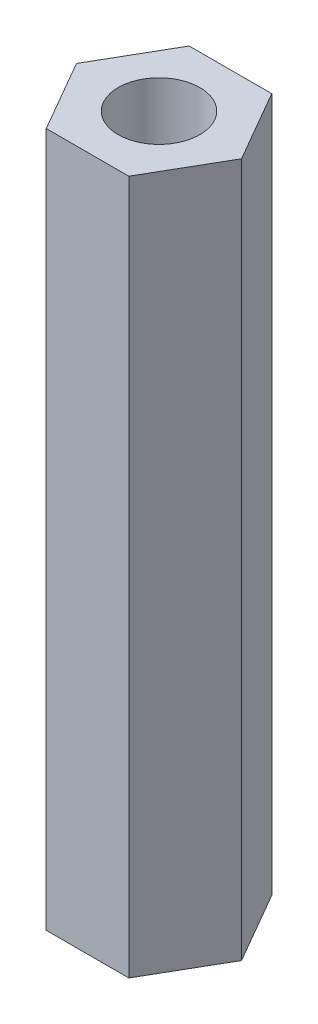
ISO-10303-21;
HEADER;
FILE_DESCRIPTION(('STEP AP214'),'2;1');
FILE_NAME('part.step','',(''),(''),'','','');
FILE_SCHEMA(('AUTOMOTIVE_DESIGN { 1 0 10303 214 1 1 1 1 }'));
ENDSEC;
DATA;
#1=APPLICATION_CONTEXT('core data for automotive mechanical design processes');
#2=APPLICATION_PROTOCOL_DEFINITION('international standard','automotive_design',2000,#1);
#3=PRODUCT_CONTEXT('',#1,'mechanical');
#4=PRODUCT('Part','Part','',(#3));
#5=PRODUCT_RELATED_PRODUCT_CATEGORY('part','',(#4));
#6=PRODUCT_DEFINITION_FORMATION('','',#4);
#7=PRODUCT_DEFINITION_CONTEXT('part definition',#1,'design');
#8=PRODUCT_DEFINITION('design','',#6,#7);
#9=PRODUCT_DEFINITION_SHAPE('','',#8);
#10=(LENGTH_UNIT() NAMED_UNIT(*) SI_UNIT(.MILLI.,.METRE.));
#11=(NAMED_UNIT(*) PLANE_ANGLE_UNIT() SI_UNIT($,.RADIAN.));
#12=(NAMED_UNIT(*) SI_UNIT($,.STERADIAN.) SOLID_ANGLE_UNIT());
#13=UNCERTAINTY_MEASURE_WITH_UNIT(LENGTH_MEASURE(1.E-05),#10,'distance_accuracy_value','');
#14=(GEOMETRIC_REPRESENTATION_CONTEXT(3) GLOBAL_UNCERTAINTY_ASSIGNED_CONTEXT((#13)) GLOBAL_UNIT_ASSIGNED_CONTEXT((#10,
#11,#12)) REPRESENTATION_CONTEXT('',''));
#15=CARTESIAN_POINT('',(0.,0.,0.));
#16=DIRECTION('',(0.,0.,1.));
#17=DIRECTION('',(1.,0.,0.));
#18=AXIS2_PLACEMENT_3D('',#15,#16,#17);
#19=CARTESIAN_POINT('',(0.,34.,0.));
#20=DIRECTION('',(0.,1.,0.));
#21=DIRECTION('',(0.,0.,1.));
#22=AXIS2_PLACEMENT_3D('',#19,#20,#21);
#23=PLANE('',#22);
#24=DIRECTION('',(-0.5,0.,-0.866025403784438));
#25=VECTOR('',#24,1.);
#26=CARTESIAN_POINT('',(4.04145188432738,34.,0.));
#27=LINE('',#26,#25);
#28=CARTESIAN_POINT('',(4.04145188432738,34.,0.));
#29=VERTEX_POINT('',#28);
#30=CARTESIAN_POINT('',(2.02072594216369,34.,-3.5));
#31=VERTEX_POINT('',#30);
#32=EDGE_CURVE('E152',#29,#31,#27,.T.);
#33=ORIENTED_EDGE('',*,*,#32,.T.);
#34=DIRECTION('',(-1.,0.,0.));
#35=VECTOR('',#34,1.);
#36=CARTESIAN_POINT('',(2.02072594216369,34.,-3.5));
#37=LINE('',#36,#35);
#38=CARTESIAN_POINT('',(-2.02072594216369,34.,-3.5));
#39=VERTEX_POINT('',#38);
#40=EDGE_CURVE('E100',#31,#39,#37,.T.);
#41=ORIENTED_EDGE('',*,*,#40,.T.);
#42=DIRECTION('',(-0.5,0.,0.866025403784439));
#43=VECTOR('',#42,1.);
#44=CARTESIAN_POINT('',(-2.02072594216369,34.,-3.5));
#45=LINE('',#44,#43);
#46=CARTESIAN_POINT('',(-4.04145188432738,34.,0.));
#47=VERTEX_POINT('',#46);
#48=EDGE_CURVE('E113',#39,#47,#45,.T.);
#49=ORIENTED_EDGE('',*,*,#48,.T.);
#50=DIRECTION('',(0.5,0.,0.866025403784438));
#51=VECTOR('',#50,1.);
#52=CARTESIAN_POINT('',(-4.04145188432738,34.,0.));
#53=LINE('',#52,#51);
#54=CARTESIAN_POINT('',(-2.02072594216369,34.,3.5));
#55=VERTEX_POINT('',#54);
#56=EDGE_CURVE('E107',#47,#55,#53,.T.);
#57=ORIENTED_EDGE('',*,*,#56,.T.);
#58=DIRECTION('',(1.,0.,0.));
#59=VECTOR('',#58,1.);
#60=CARTESIAN_POINT('',(-2.02072594216369,34.,3.5));
#61=LINE('',#60,#59);
#62=CARTESIAN_POINT('',(2.02072594216369,34.,3.5));
#63=VERTEX_POINT('',#62);
#64=EDGE_CURVE('E111',#55,#63,#61,.T.);
#65=ORIENTED_EDGE('',*,*,#64,.T.);
#66=DIRECTION('',(0.5,0.,-0.866025403784439));
#67=VECTOR('',#66,1.);
#68=CARTESIAN_POINT('',(2.02072594216369,34.,3.5));
#69=LINE('',#68,#67);
#70=EDGE_CURVE('E63',#63,#29,#69,.T.);
#71=ORIENTED_EDGE('',*,*,#70,.T.);
#72=EDGE_LOOP('',(#33,#41,#49,#57,#65,#71));
#73=FACE_BOUND('',#72,.T.);
#74=CARTESIAN_POINT('',(0.,34.,0.));
#75=DIRECTION('',(0.,1.,0.));
#76=DIRECTION('',(0.,0.,1.));
#77=AXIS2_PLACEMENT_3D('',#74,#75,#76);
#78=CIRCLE('',#77,2.);
#79=CARTESIAN_POINT('',(0.,34.,2.));
#80=VERTEX_POINT('',#79);
#81=EDGE_CURVE('E140',#80,#80,#78,.T.);
#82=ORIENTED_EDGE('',*,*,#81,.F.);
#83=EDGE_LOOP('',(#82));
#84=FACE_BOUND('',#83,.T.);
#85=ADVANCED_FACE('F45',(#73,#84),#23,.T.);
#86=CARTESIAN_POINT('',(0.,0.,0.));
#87=DIRECTION('',(0.,1.,0.));
#88=DIRECTION('',(0.,0.,1.));
#89=AXIS2_PLACEMENT_3D('',#86,#87,#88);
#90=PLANE('',#89);
#91=DIRECTION('',(-0.5,0.,-0.866025403784438));
#92=VECTOR('',#91,1.);
#93=CARTESIAN_POINT('',(4.04145188432738,0.,0.));
#94=LINE('',#93,#92);
#95=CARTESIAN_POINT('',(4.04145188432738,0.,0.));
#96=VERTEX_POINT('',#95);
#97=CARTESIAN_POINT('',(2.02072594216369,0.,-3.5));
#98=VERTEX_POINT('',#97);
#99=EDGE_CURVE('E135',#96,#98,#94,.T.);
#100=ORIENTED_EDGE('',*,*,#99,.F.);
#101=DIRECTION('',(0.5,0.,-0.866025403784439));
#102=VECTOR('',#101,1.);
#103=CARTESIAN_POINT('',(2.02072594216369,0.,3.5));
#104=LINE('',#103,#102);
#105=CARTESIAN_POINT('',(2.02072594216369,0.,3.5));
#106=VERTEX_POINT('',#105);
#107=EDGE_CURVE('E92',#106,#96,#104,.T.);
#108=ORIENTED_EDGE('',*,*,#107,.F.);
#109=DIRECTION('',(1.,0.,0.));
#110=VECTOR('',#109,1.);
#111=CARTESIAN_POINT('',(-2.02072594216369,0.,3.5));
#112=LINE('',#111,#110);
#113=CARTESIAN_POINT('',(-2.02072594216369,0.,3.5));
#114=VERTEX_POINT('',#113);
#115=EDGE_CURVE('E86',#114,#106,#112,.T.);
#116=ORIENTED_EDGE('',*,*,#115,.F.);
#117=DIRECTION('',(0.5,0.,0.866025403784438));
#118=VECTOR('',#117,1.);
#119=CARTESIAN_POINT('',(-4.04145188432738,0.,0.));
#120=LINE('',#119,#118);
#121=CARTESIAN_POINT('',(-4.04145188432738,0.,0.));
#122=VERTEX_POINT('',#121);
#123=EDGE_CURVE('E122',#122,#114,#120,.T.);
#124=ORIENTED_EDGE('',*,*,#123,.F.);
#125=DIRECTION('',(-0.5,0.,0.866025403784439));
#126=VECTOR('',#125,1.);
#127=CARTESIAN_POINT('',(-2.02072594216369,0.,-3.5));
#128=LINE('',#127,#126);
#129=CARTESIAN_POINT('',(-2.02072594216369,0.,-3.5));
#130=VERTEX_POINT('',#129);
#131=EDGE_CURVE('E143',#130,#122,#128,.T.);
#132=ORIENTED_EDGE('',*,*,#131,.F.);
#133=DIRECTION('',(-1.,0.,0.));
#134=VECTOR('',#133,1.);
#135=CARTESIAN_POINT('',(2.02072594216369,0.,-3.5));
#136=LINE('',#135,#134);
#137=EDGE_CURVE('E139',#98,#130,#136,.T.);
#138=ORIENTED_EDGE('',*,*,#137,.F.);
#139=EDGE_LOOP('',(#100,#108,#116,#124,#132,#138));
#140=FACE_BOUND('',#139,.T.);
#141=CARTESIAN_POINT('',(0.,0.,0.));
#142=DIRECTION('',(0.,1.,0.));
#143=DIRECTION('',(0.,0.,1.));
#144=AXIS2_PLACEMENT_3D('',#141,#142,#143);
#145=CIRCLE('',#144,2.);
#146=CARTESIAN_POINT('',(0.,0.,2.));
#147=VERTEX_POINT('',#146);
#148=EDGE_CURVE('E249',#147,#147,#145,.T.);
#149=ORIENTED_EDGE('',*,*,#148,.T.);
#150=EDGE_LOOP('',(#149));
#151=FACE_BOUND('',#150,.T.);
#152=ADVANCED_FACE('F165',(#140,#151),#90,.F.);
#153=CARTESIAN_POINT('',(4.04145188432738,34.,0.));
#154=DIRECTION('',(-0.866025403784439,0.,0.5));
#155=DIRECTION('',(0.5,0.,0.866025403784439));
#156=AXIS2_PLACEMENT_3D('',#153,#154,#155);
#157=PLANE('',#156);
#158=ORIENTED_EDGE('',*,*,#99,.T.);
#159=DIRECTION('',(0.,-1.,0.));
#160=VECTOR('',#159,1.);
#161=CARTESIAN_POINT('',(2.02072594216369,34.,-3.5));
#162=LINE('',#161,#160);
#163=EDGE_CURVE('E11',#31,#98,#162,.T.);
#164=ORIENTED_EDGE('',*,*,#163,.F.);
#165=ORIENTED_EDGE('',*,*,#32,.F.);
#166=DIRECTION('',(0.,-1.,0.));
#167=VECTOR('',#166,1.);
#168=CARTESIAN_POINT('',(4.04145188432738,34.,0.));
#169=LINE('',#168,#167);
#170=EDGE_CURVE('E131',#29,#96,#169,.T.);
#171=ORIENTED_EDGE('',*,*,#170,.T.);
#172=EDGE_LOOP('',(#158,#164,#165,#171));
#173=FACE_BOUND('',#172,.T.);
#174=ADVANCED_FACE('F47',(#173),#157,.F.);
#175=CARTESIAN_POINT('',(2.02072594216369,34.,-3.5));
#176=DIRECTION('',(0.,0.,1.));
#177=DIRECTION('',(1.,0.,0.));
#178=AXIS2_PLACEMENT_3D('',#175,#176,#177);
#179=PLANE('',#178);
#180=ORIENTED_EDGE('',*,*,#137,.T.);
#181=DIRECTION('',(0.,-1.,0.));
#182=VECTOR('',#181,1.);
#183=CARTESIAN_POINT('',(-2.02072594216369,34.,-3.5));
#184=LINE('',#183,#182);
#185=EDGE_CURVE('E55',#39,#130,#184,.T.);
#186=ORIENTED_EDGE('',*,*,#185,.F.);
#187=ORIENTED_EDGE('',*,*,#40,.F.);
#188=ORIENTED_EDGE('',*,*,#163,.T.);
#189=EDGE_LOOP('',(#180,#186,#187,#188));
#190=FACE_BOUND('',#189,.T.);
#191=ADVANCED_FACE('F190',(#190),#179,.F.);
#192=CARTESIAN_POINT('',(-2.02072594216369,34.,-3.5));
#193=DIRECTION('',(0.866025403784439,0.,0.5));
#194=DIRECTION('',(0.5,0.,-0.866025403784439));
#195=AXIS2_PLACEMENT_3D('',#192,#193,#194);
#196=PLANE('',#195);
#197=ORIENTED_EDGE('',*,*,#131,.T.);
#198=DIRECTION('',(0.,-1.,0.));
#199=VECTOR('',#198,1.);
#200=CARTESIAN_POINT('',(-4.04145188432738,34.,0.));
#201=LINE('',#200,#199);
#202=EDGE_CURVE('E124',#47,#122,#201,.T.);
#203=ORIENTED_EDGE('',*,*,#202,.F.);
#204=ORIENTED_EDGE('',*,*,#48,.F.);
#205=ORIENTED_EDGE('',*,*,#185,.T.);
#206=EDGE_LOOP('',(#197,#203,#204,#205));
#207=FACE_BOUND('',#206,.T.);
#208=ADVANCED_FACE('F162',(#207),#196,.F.);
#209=CARTESIAN_POINT('',(-4.04145188432738,34.,0.));
#210=DIRECTION('',(0.866025403784438,0.,-0.5));
#211=DIRECTION('',(-0.5,0.,-0.866025403784438));
#212=AXIS2_PLACEMENT_3D('',#209,#210,#211);
#213=PLANE('',#212);
#214=ORIENTED_EDGE('',*,*,#123,.T.);
#215=DIRECTION('',(0.,-1.,0.));
#216=VECTOR('',#215,1.);
#217=CARTESIAN_POINT('',(-2.02072594216369,34.,3.5));
#218=LINE('',#217,#216);
#219=EDGE_CURVE('E119',#55,#114,#218,.T.);
#220=ORIENTED_EDGE('',*,*,#219,.F.);
#221=ORIENTED_EDGE('',*,*,#56,.F.);
#222=ORIENTED_EDGE('',*,*,#202,.T.);
#223=EDGE_LOOP('',(#214,#220,#221,#222));
#224=FACE_BOUND('',#223,.T.);
#225=ADVANCED_FACE('F120',(#224),#213,.F.);
#226=CARTESIAN_POINT('',(-2.02072594216369,34.,3.5));
#227=DIRECTION('',(0.,0.,-1.));
#228=DIRECTION('',(-1.,0.,0.));
#229=AXIS2_PLACEMENT_3D('',#226,#227,#228);
#230=PLANE('',#229);
#231=ORIENTED_EDGE('',*,*,#115,.T.);
#232=DIRECTION('',(0.,-1.,0.));
#233=VECTOR('',#232,1.);
#234=CARTESIAN_POINT('',(2.02072594216369,34.,3.5));
#235=LINE('',#234,#233);
#236=EDGE_CURVE('E125',#63,#106,#235,.T.);
#237=ORIENTED_EDGE('',*,*,#236,.F.);
#238=ORIENTED_EDGE('',*,*,#64,.F.);
#239=ORIENTED_EDGE('',*,*,#219,.T.);
#240=EDGE_LOOP('',(#231,#237,#238,#239));
#241=FACE_BOUND('',#240,.T.);
#242=ADVANCED_FACE('F127',(#241),#230,.F.);
#243=CARTESIAN_POINT('',(2.02072594216369,34.,3.5));
#244=DIRECTION('',(-0.866025403784439,0.,-0.5));
#245=DIRECTION('',(-0.5,0.,0.866025403784439));
#246=AXIS2_PLACEMENT_3D('',#243,#244,#245);
#247=PLANE('',#246);
#248=ORIENTED_EDGE('',*,*,#107,.T.);
#249=ORIENTED_EDGE('',*,*,#170,.F.);
#250=ORIENTED_EDGE('',*,*,#70,.F.);
#251=ORIENTED_EDGE('',*,*,#236,.T.);
#252=EDGE_LOOP('',(#248,#249,#250,#251));
#253=FACE_BOUND('',#252,.T.);
#254=ADVANCED_FACE('F170',(#253),#247,.F.);
#255=CARTESIAN_POINT('',(0.,34.,0.));
#256=DIRECTION('',(0.,-1.,0.));
#257=DIRECTION('',(0.,0.,-1.));
#258=AXIS2_PLACEMENT_3D('',#255,#256,#257);
#259=CYLINDRICAL_SURFACE('',#258,2.);
#260=ORIENTED_EDGE('',*,*,#81,.T.);
#261=EDGE_LOOP('',(#260));
#262=FACE_BOUND('',#261,.T.);
#263=ORIENTED_EDGE('',*,*,#148,.F.);
#264=EDGE_LOOP('',(#263));
#265=FACE_BOUND('',#264,.T.);
#266=ADVANCED_FACE('F172',(#262,#265),#259,.F.);
#267=CLOSED_SHELL('',(#85,#152,#174,#191,#208,#225,#242,#254,#266));
#268=MANIFOLD_SOLID_BREP('B2',#267);
#269=ADVANCED_BREP_SHAPE_REPRESENTATION('',(#18,#268),#14);
#270=SHAPE_DEFINITION_REPRESENTATION(#9,#269);
ENDSEC;
END-ISO-10303-21;
